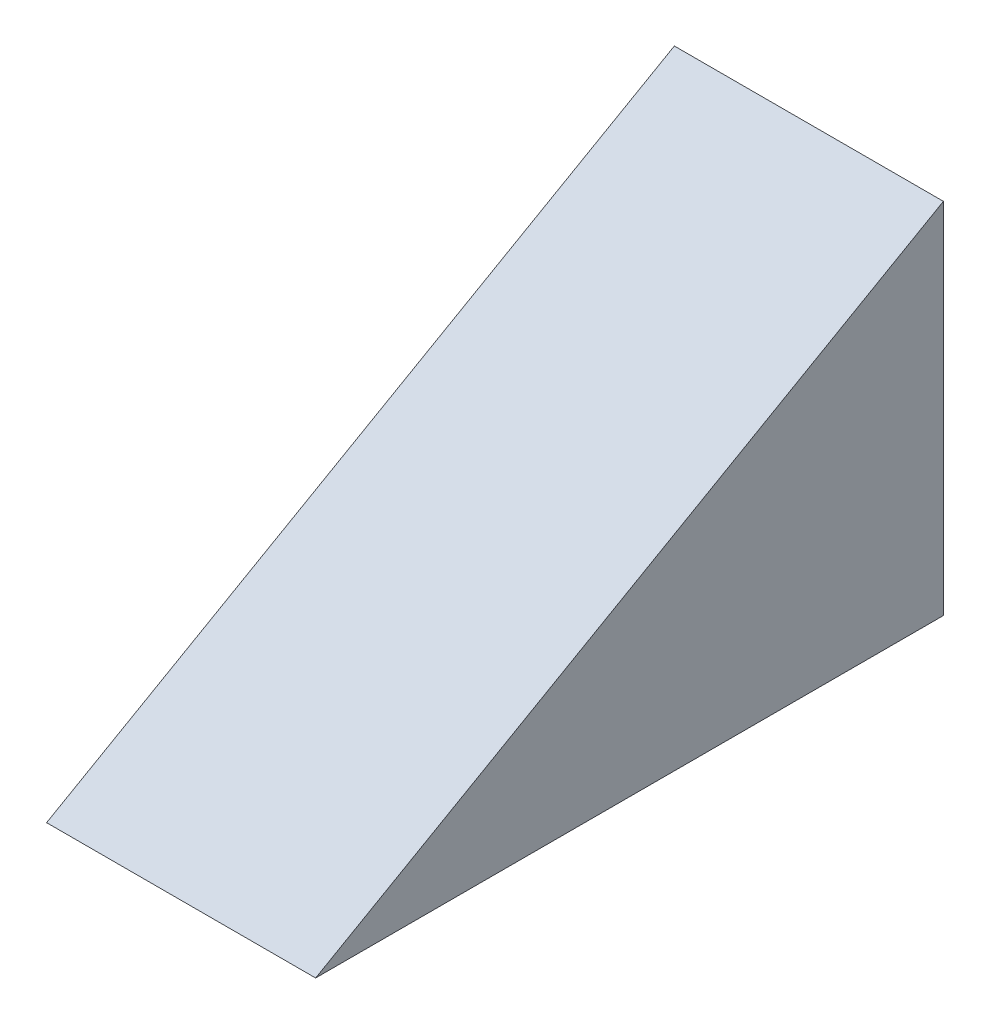
ISO-10303-21;
HEADER;
FILE_DESCRIPTION(('STEP AP214'),'2;1');
FILE_NAME('part.step','',(''),(''),'','','');
FILE_SCHEMA(('AUTOMOTIVE_DESIGN { 1 0 10303 214 1 1 1 1 }'));
ENDSEC;
DATA;
#1=APPLICATION_CONTEXT('core data for automotive mechanical design processes');
#2=APPLICATION_PROTOCOL_DEFINITION('international standard','automotive_design',2000,#1);
#3=PRODUCT_CONTEXT('',#1,'mechanical');
#4=PRODUCT('Part','Part','',(#3));
#5=PRODUCT_RELATED_PRODUCT_CATEGORY('part','',(#4));
#6=PRODUCT_DEFINITION_FORMATION('','',#4);
#7=PRODUCT_DEFINITION_CONTEXT('part definition',#1,'design');
#8=PRODUCT_DEFINITION('design','',#6,#7);
#9=PRODUCT_DEFINITION_SHAPE('','',#8);
#10=(LENGTH_UNIT() NAMED_UNIT(*) SI_UNIT(.MILLI.,.METRE.));
#11=(NAMED_UNIT(*) PLANE_ANGLE_UNIT() SI_UNIT($,.RADIAN.));
#12=(NAMED_UNIT(*) SI_UNIT($,.STERADIAN.) SOLID_ANGLE_UNIT());
#13=UNCERTAINTY_MEASURE_WITH_UNIT(LENGTH_MEASURE(1.E-05),#10,'distance_accuracy_value','');
#14=(GEOMETRIC_REPRESENTATION_CONTEXT(3) GLOBAL_UNCERTAINTY_ASSIGNED_CONTEXT((#13)) GLOBAL_UNIT_ASSIGNED_CONTEXT((#10,
#11,#12)) REPRESENTATION_CONTEXT('',''));
#15=CARTESIAN_POINT('',(0.,0.,0.));
#16=DIRECTION('',(0.,0.,1.));
#17=DIRECTION('',(1.,0.,0.));
#18=AXIS2_PLACEMENT_3D('',#15,#16,#17);
#19=CARTESIAN_POINT('',(15.,20.,-35.));
#20=DIRECTION('',(0.,-0.868243142124459,-0.496138938356834));
#21=DIRECTION('',(0.,0.496138938356834,-0.868243142124459));
#22=AXIS2_PLACEMENT_3D('',#19,#20,#21);
#23=PLANE('',#22);
#24=DIRECTION('',(0.,-0.496138938356834,0.868243142124459));
#25=VECTOR('',#24,1.);
#26=CARTESIAN_POINT('',(0.,20.,-35.));
#27=LINE('',#26,#25);
#28=CARTESIAN_POINT('',(0.,20.,-35.));
#29=VERTEX_POINT('',#28);
#30=CARTESIAN_POINT('',(0.,0.,0.));
#31=VERTEX_POINT('',#30);
#32=EDGE_CURVE('E80',#29,#31,#27,.T.);
#33=ORIENTED_EDGE('',*,*,#32,.T.);
#34=DIRECTION('',(-1.,0.,0.));
#35=VECTOR('',#34,1.);
#36=CARTESIAN_POINT('',(15.,0.,0.));
#37=LINE('',#36,#35);
#38=CARTESIAN_POINT('',(15.,0.,0.));
#39=VERTEX_POINT('',#38);
#40=EDGE_CURVE('E11',#39,#31,#37,.T.);
#41=ORIENTED_EDGE('',*,*,#40,.F.);
#42=DIRECTION('',(0.,-0.496138938356834,0.868243142124459));
#43=VECTOR('',#42,1.);
#44=CARTESIAN_POINT('',(15.,20.,-35.));
#45=LINE('',#44,#43);
#46=CARTESIAN_POINT('',(15.,20.,-35.));
#47=VERTEX_POINT('',#46);
#48=EDGE_CURVE('E73',#47,#39,#45,.T.);
#49=ORIENTED_EDGE('',*,*,#48,.F.);
#50=DIRECTION('',(-1.,0.,0.));
#51=VECTOR('',#50,1.);
#52=CARTESIAN_POINT('',(15.,20.,-35.));
#53=LINE('',#52,#51);
#54=EDGE_CURVE('E81',#47,#29,#53,.T.);
#55=ORIENTED_EDGE('',*,*,#54,.T.);
#56=EDGE_LOOP('',(#33,#41,#49,#55));
#57=FACE_BOUND('',#56,.T.);
#58=ADVANCED_FACE('F33',(#57),#23,.F.);
#59=CARTESIAN_POINT('',(15.,0.,0.));
#60=DIRECTION('',(0.,1.,0.));
#61=DIRECTION('',(0.,0.,1.));
#62=AXIS2_PLACEMENT_3D('',#59,#60,#61);
#63=PLANE('',#62);
#64=DIRECTION('',(0.,0.,-1.));
#65=VECTOR('',#64,1.);
#66=CARTESIAN_POINT('',(0.,0.,0.));
#67=LINE('',#66,#65);
#68=CARTESIAN_POINT('',(0.,0.,-35.));
#69=VERTEX_POINT('',#68);
#70=EDGE_CURVE('E61',#31,#69,#67,.T.);
#71=ORIENTED_EDGE('',*,*,#70,.T.);
#72=DIRECTION('',(-1.,0.,0.));
#73=VECTOR('',#72,1.);
#74=CARTESIAN_POINT('',(15.,0.,-35.));
#75=LINE('',#74,#73);
#76=CARTESIAN_POINT('',(15.,0.,-35.));
#77=VERTEX_POINT('',#76);
#78=EDGE_CURVE('E41',#77,#69,#75,.T.);
#79=ORIENTED_EDGE('',*,*,#78,.F.);
#80=DIRECTION('',(0.,0.,-1.));
#81=VECTOR('',#80,1.);
#82=CARTESIAN_POINT('',(15.,0.,0.));
#83=LINE('',#82,#81);
#84=EDGE_CURVE('E69',#39,#77,#83,.T.);
#85=ORIENTED_EDGE('',*,*,#84,.F.);
#86=ORIENTED_EDGE('',*,*,#40,.T.);
#87=EDGE_LOOP('',(#71,#79,#85,#86));
#88=FACE_BOUND('',#87,.T.);
#89=ADVANCED_FACE('F70',(#88),#63,.F.);
#90=CARTESIAN_POINT('',(15.,0.,-35.));
#91=DIRECTION('',(0.,0.,1.));
#92=DIRECTION('',(1.,0.,0.));
#93=AXIS2_PLACEMENT_3D('',#90,#91,#92);
#94=PLANE('',#93);
#95=DIRECTION('',(0.,1.,0.));
#96=VECTOR('',#95,1.);
#97=CARTESIAN_POINT('',(0.,0.,-35.));
#98=LINE('',#97,#96);
#99=EDGE_CURVE('E66',#69,#29,#98,.T.);
#100=ORIENTED_EDGE('',*,*,#99,.T.);
#101=ORIENTED_EDGE('',*,*,#54,.F.);
#102=DIRECTION('',(0.,1.,0.));
#103=VECTOR('',#102,1.);
#104=CARTESIAN_POINT('',(15.,0.,-35.));
#105=LINE('',#104,#103);
#106=EDGE_CURVE('E49',#77,#47,#105,.T.);
#107=ORIENTED_EDGE('',*,*,#106,.F.);
#108=ORIENTED_EDGE('',*,*,#78,.T.);
#109=EDGE_LOOP('',(#100,#101,#107,#108));
#110=FACE_BOUND('',#109,.T.);
#111=ADVANCED_FACE('F88',(#110),#94,.F.);
#112=CARTESIAN_POINT('',(15.,0.,0.));
#113=DIRECTION('',(-1.,0.,0.));
#114=DIRECTION('',(0.,0.,1.));
#115=AXIS2_PLACEMENT_3D('',#112,#113,#114);
#116=PLANE('',#115);
#117=ORIENTED_EDGE('',*,*,#48,.T.);
#118=ORIENTED_EDGE('',*,*,#84,.T.);
#119=ORIENTED_EDGE('',*,*,#106,.T.);
#120=EDGE_LOOP('',(#117,#118,#119));
#121=FACE_BOUND('',#120,.T.);
#122=ADVANCED_FACE('F76',(#121),#116,.F.);
#123=CARTESIAN_POINT('',(0.,0.,0.));
#124=DIRECTION('',(-1.,0.,0.));
#125=DIRECTION('',(0.,0.,1.));
#126=AXIS2_PLACEMENT_3D('',#123,#124,#125);
#127=PLANE('',#126);
#128=ORIENTED_EDGE('',*,*,#32,.F.);
#129=ORIENTED_EDGE('',*,*,#99,.F.);
#130=ORIENTED_EDGE('',*,*,#70,.F.);
#131=EDGE_LOOP('',(#128,#129,#130));
#132=FACE_BOUND('',#131,.T.);
#133=ADVANCED_FACE('F89',(#132),#127,.T.);
#134=CLOSED_SHELL('',(#58,#89,#111,#122,#133));
#135=MANIFOLD_SOLID_BREP('B2',#134);
#136=ADVANCED_BREP_SHAPE_REPRESENTATION('',(#18,#135),#14);
#137=SHAPE_DEFINITION_REPRESENTATION(#9,#136);
ENDSEC;
END-ISO-10303-21;
